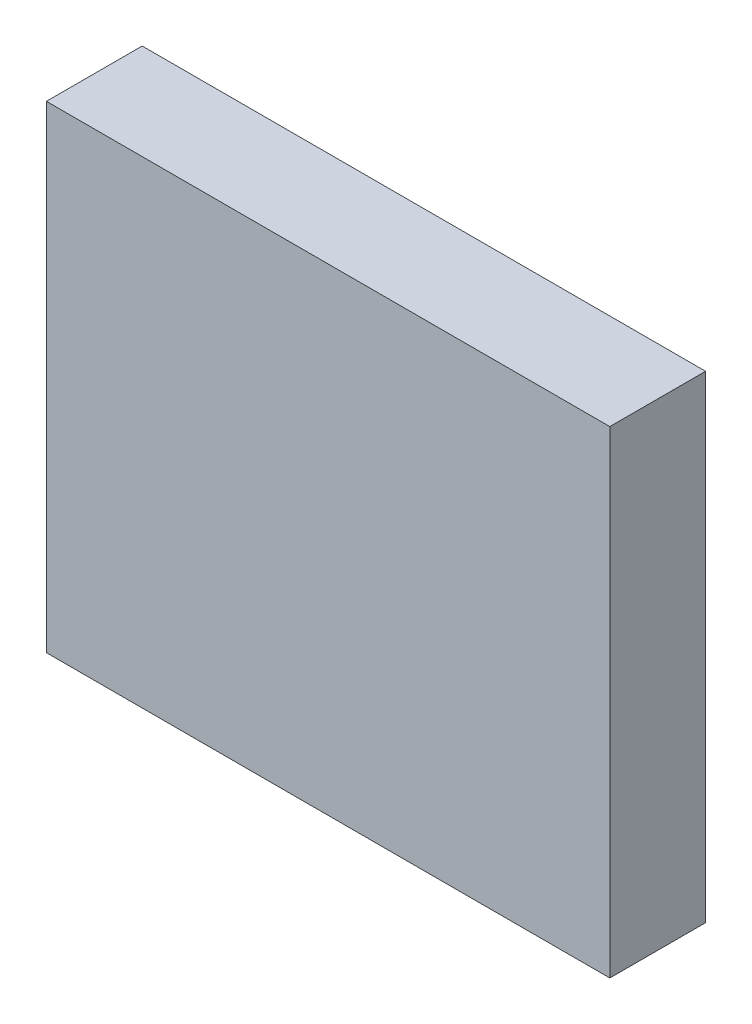
ISO-10303-21;
HEADER;
FILE_DESCRIPTION(('STEP AP214'),'2;1');
FILE_NAME('part.step','',(''),(''),'','','');
FILE_SCHEMA(('AUTOMOTIVE_DESIGN { 1 0 10303 214 1 1 1 1 }'));
ENDSEC;
DATA;
#1=APPLICATION_CONTEXT('core data for automotive mechanical design processes');
#2=APPLICATION_PROTOCOL_DEFINITION('international standard','automotive_design',2000,#1);
#3=PRODUCT_CONTEXT('',#1,'mechanical');
#4=PRODUCT('Part','Part','',(#3));
#5=PRODUCT_RELATED_PRODUCT_CATEGORY('part','',(#4));
#6=PRODUCT_DEFINITION_FORMATION('','',#4);
#7=PRODUCT_DEFINITION_CONTEXT('part definition',#1,'design');
#8=PRODUCT_DEFINITION('design','',#6,#7);
#9=PRODUCT_DEFINITION_SHAPE('','',#8);
#10=(LENGTH_UNIT() NAMED_UNIT(*) SI_UNIT(.MILLI.,.METRE.));
#11=(NAMED_UNIT(*) PLANE_ANGLE_UNIT() SI_UNIT($,.RADIAN.));
#12=(NAMED_UNIT(*) SI_UNIT($,.STERADIAN.) SOLID_ANGLE_UNIT());
#13=UNCERTAINTY_MEASURE_WITH_UNIT(LENGTH_MEASURE(1.E-05),#10,'distance_accuracy_value','');
#14=(GEOMETRIC_REPRESENTATION_CONTEXT(3) GLOBAL_UNCERTAINTY_ASSIGNED_CONTEXT((#13)) GLOBAL_UNIT_ASSIGNED_CONTEXT((#10,
#11,#12)) REPRESENTATION_CONTEXT('',''));
#15=CARTESIAN_POINT('',(0.,0.,0.));
#16=DIRECTION('',(0.,0.,1.));
#17=DIRECTION('',(1.,0.,0.));
#18=AXIS2_PLACEMENT_3D('',#15,#16,#17);
#19=CARTESIAN_POINT('',(10.5,-8.9,3.57));
#20=DIRECTION('',(0.,-1.,0.));
#21=DIRECTION('',(1.,0.,0.));
#22=AXIS2_PLACEMENT_3D('',#19,#20,#21);
#23=PLANE('',#22);
#24=DIRECTION('',(-1.,0.,0.));
#25=VECTOR('',#24,1.);
#26=CARTESIAN_POINT('',(10.5,-8.9,0.));
#27=LINE('',#26,#25);
#28=CARTESIAN_POINT('',(10.5,-8.9,0.));
#29=VERTEX_POINT('',#28);
#30=CARTESIAN_POINT('',(-10.5,-8.9,0.));
#31=VERTEX_POINT('',#30);
#32=EDGE_CURVE('E116',#29,#31,#27,.T.);
#33=ORIENTED_EDGE('',*,*,#32,.F.);
#34=DIRECTION('',(0.,0.,-1.));
#35=VECTOR('',#34,1.);
#36=CARTESIAN_POINT('',(10.5,-8.9,3.57));
#37=LINE('',#36,#35);
#38=CARTESIAN_POINT('',(10.5,-8.9,3.57));
#39=VERTEX_POINT('',#38);
#40=EDGE_CURVE('E11',#39,#29,#37,.T.);
#41=ORIENTED_EDGE('',*,*,#40,.F.);
#42=DIRECTION('',(-1.,0.,0.));
#43=VECTOR('',#42,1.);
#44=CARTESIAN_POINT('',(10.5,-8.9,3.57));
#45=LINE('',#44,#43);
#46=CARTESIAN_POINT('',(-10.5,-8.9,3.57));
#47=VERTEX_POINT('',#46);
#48=EDGE_CURVE('E109',#39,#47,#45,.T.);
#49=ORIENTED_EDGE('',*,*,#48,.T.);
#50=DIRECTION('',(0.,0.,-1.));
#51=VECTOR('',#50,1.);
#52=CARTESIAN_POINT('',(-10.5,-8.9,3.57));
#53=LINE('',#52,#51);
#54=EDGE_CURVE('E48',#47,#31,#53,.T.);
#55=ORIENTED_EDGE('',*,*,#54,.T.);
#56=EDGE_LOOP('',(#33,#41,#49,#55));
#57=FACE_BOUND('',#56,.T.);
#58=ADVANCED_FACE('F45',(#57),#23,.T.);
#59=CARTESIAN_POINT('',(10.5,-8.9,3.57));
#60=DIRECTION('',(-1.,0.,0.));
#61=DIRECTION('',(0.,0.,1.));
#62=AXIS2_PLACEMENT_3D('',#59,#60,#61);
#63=PLANE('',#62);
#64=DIRECTION('',(0.,1.,0.));
#65=VECTOR('',#64,1.);
#66=CARTESIAN_POINT('',(10.5,-8.9,0.));
#67=LINE('',#66,#65);
#68=CARTESIAN_POINT('',(10.5,8.9,0.));
#69=VERTEX_POINT('',#68);
#70=EDGE_CURVE('E79',#29,#69,#67,.T.);
#71=ORIENTED_EDGE('',*,*,#70,.T.);
#72=DIRECTION('',(0.,0.,-1.));
#73=VECTOR('',#72,1.);
#74=CARTESIAN_POINT('',(10.5,8.9,3.57));
#75=LINE('',#74,#73);
#76=CARTESIAN_POINT('',(10.5,8.9,3.57));
#77=VERTEX_POINT('',#76);
#78=EDGE_CURVE('E55',#77,#69,#75,.T.);
#79=ORIENTED_EDGE('',*,*,#78,.F.);
#80=DIRECTION('',(0.,1.,0.));
#81=VECTOR('',#80,1.);
#82=CARTESIAN_POINT('',(10.5,-8.9,3.57));
#83=LINE('',#82,#81);
#84=EDGE_CURVE('E96',#39,#77,#83,.T.);
#85=ORIENTED_EDGE('',*,*,#84,.F.);
#86=ORIENTED_EDGE('',*,*,#40,.T.);
#87=EDGE_LOOP('',(#71,#79,#85,#86));
#88=FACE_BOUND('',#87,.T.);
#89=ADVANCED_FACE('F132',(#88),#63,.F.);
#90=CARTESIAN_POINT('',(10.5,8.9,3.57));
#91=DIRECTION('',(0.,-1.,0.));
#92=DIRECTION('',(1.,0.,0.));
#93=AXIS2_PLACEMENT_3D('',#90,#91,#92);
#94=PLANE('',#93);
#95=DIRECTION('',(-1.,0.,0.));
#96=VECTOR('',#95,1.);
#97=CARTESIAN_POINT('',(10.5,8.9,0.));
#98=LINE('',#97,#96);
#99=CARTESIAN_POINT('',(-10.5,8.9,0.));
#100=VERTEX_POINT('',#99);
#101=EDGE_CURVE('E104',#69,#100,#98,.T.);
#102=ORIENTED_EDGE('',*,*,#101,.T.);
#103=DIRECTION('',(0.,0.,-1.));
#104=VECTOR('',#103,1.);
#105=CARTESIAN_POINT('',(-10.5,8.9,3.57));
#106=LINE('',#105,#104);
#107=CARTESIAN_POINT('',(-10.5,8.9,3.57));
#108=VERTEX_POINT('',#107);
#109=EDGE_CURVE('E101',#108,#100,#106,.T.);
#110=ORIENTED_EDGE('',*,*,#109,.F.);
#111=DIRECTION('',(-1.,0.,0.));
#112=VECTOR('',#111,1.);
#113=CARTESIAN_POINT('',(10.5,8.9,3.57));
#114=LINE('',#113,#112);
#115=EDGE_CURVE('E91',#77,#108,#114,.T.);
#116=ORIENTED_EDGE('',*,*,#115,.F.);
#117=ORIENTED_EDGE('',*,*,#78,.T.);
#118=EDGE_LOOP('',(#102,#110,#116,#117));
#119=FACE_BOUND('',#118,.T.);
#120=ADVANCED_FACE('F102',(#119),#94,.F.);
#121=CARTESIAN_POINT('',(-10.5,-8.9,3.57));
#122=DIRECTION('',(-1.,0.,0.));
#123=DIRECTION('',(0.,0.,1.));
#124=AXIS2_PLACEMENT_3D('',#121,#122,#123);
#125=PLANE('',#124);
#126=DIRECTION('',(0.,1.,0.));
#127=VECTOR('',#126,1.);
#128=CARTESIAN_POINT('',(-10.5,-8.9,0.));
#129=LINE('',#128,#127);
#130=EDGE_CURVE('E120',#31,#100,#129,.T.);
#131=ORIENTED_EDGE('',*,*,#130,.F.);
#132=ORIENTED_EDGE('',*,*,#54,.F.);
#133=DIRECTION('',(0.,1.,0.));
#134=VECTOR('',#133,1.);
#135=CARTESIAN_POINT('',(-10.5,-8.9,3.57));
#136=LINE('',#135,#134);
#137=EDGE_CURVE('E95',#47,#108,#136,.T.);
#138=ORIENTED_EDGE('',*,*,#137,.T.);
#139=ORIENTED_EDGE('',*,*,#109,.T.);
#140=EDGE_LOOP('',(#131,#132,#138,#139));
#141=FACE_BOUND('',#140,.T.);
#142=ADVANCED_FACE('F107',(#141),#125,.T.);
#143=CARTESIAN_POINT('',(0.,0.,3.57));
#144=DIRECTION('',(0.,0.,-1.));
#145=DIRECTION('',(-1.,0.,0.));
#146=AXIS2_PLACEMENT_3D('',#143,#144,#145);
#147=PLANE('',#146);
#148=ORIENTED_EDGE('',*,*,#48,.F.);
#149=ORIENTED_EDGE('',*,*,#84,.T.);
#150=ORIENTED_EDGE('',*,*,#115,.T.);
#151=ORIENTED_EDGE('',*,*,#137,.F.);
#152=EDGE_LOOP('',(#148,#149,#150,#151));
#153=FACE_BOUND('',#152,.T.);
#154=ADVANCED_FACE('F94',(#153),#147,.F.);
#155=CARTESIAN_POINT('',(0.,0.,0.));
#156=DIRECTION('',(0.,0.,-1.));
#157=DIRECTION('',(-1.,0.,0.));
#158=AXIS2_PLACEMENT_3D('',#155,#156,#157);
#159=PLANE('',#158);
#160=ORIENTED_EDGE('',*,*,#32,.T.);
#161=ORIENTED_EDGE('',*,*,#130,.T.);
#162=ORIENTED_EDGE('',*,*,#101,.F.);
#163=ORIENTED_EDGE('',*,*,#70,.F.);
#164=EDGE_LOOP('',(#160,#161,#162,#163));
#165=FACE_BOUND('',#164,.T.);
#166=ADVANCED_FACE('F129',(#165),#159,.T.);
#167=CLOSED_SHELL('',(#58,#89,#120,#142,#154,#166));
#168=MANIFOLD_SOLID_BREP('B2',#167);
#169=ADVANCED_BREP_SHAPE_REPRESENTATION('',(#18,#168),#14);
#170=SHAPE_DEFINITION_REPRESENTATION(#9,#169);
ENDSEC;
END-ISO-10303-21;
